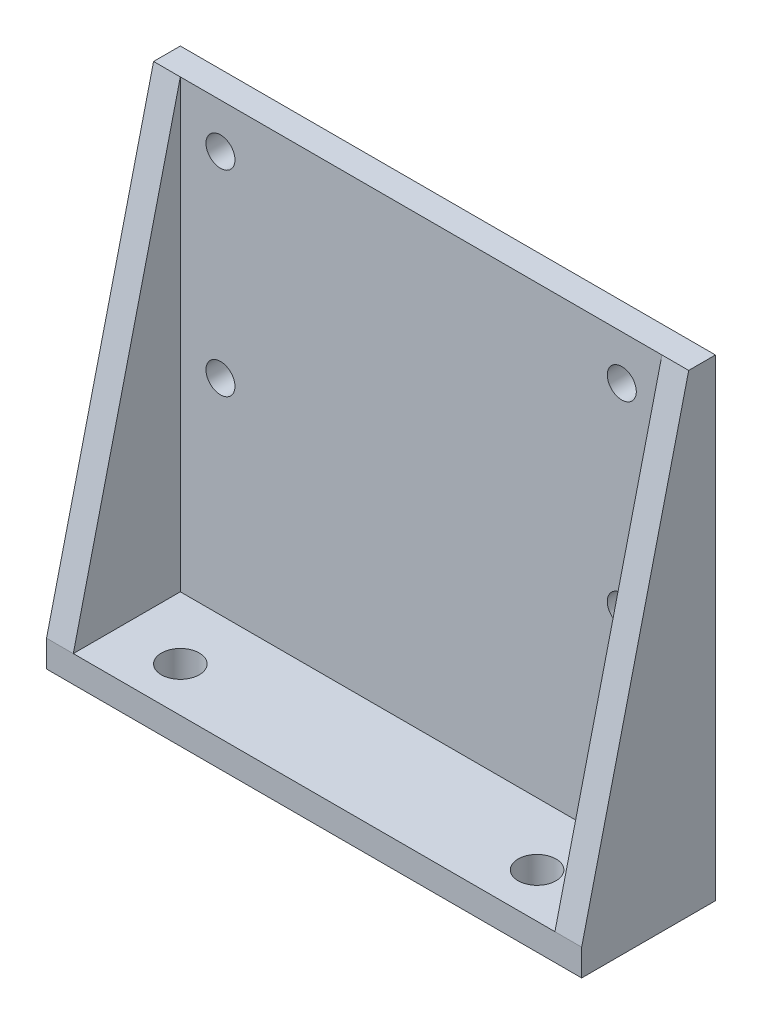
ISO-10303-21;
HEADER;
FILE_DESCRIPTION(('STEP AP214'),'2;1');
FILE_NAME('part.step','',(''),(''),'','','');
FILE_SCHEMA(('AUTOMOTIVE_DESIGN { 1 0 10303 214 1 1 1 1 }'));
ENDSEC;
DATA;
#1=APPLICATION_CONTEXT('core data for automotive mechanical design processes');
#2=APPLICATION_PROTOCOL_DEFINITION('international standard','automotive_design',2000,#1);
#3=PRODUCT_CONTEXT('',#1,'mechanical');
#4=PRODUCT('Part','Part','',(#3));
#5=PRODUCT_RELATED_PRODUCT_CATEGORY('part','',(#4));
#6=PRODUCT_DEFINITION_FORMATION('','',#4);
#7=PRODUCT_DEFINITION_CONTEXT('part definition',#1,'design');
#8=PRODUCT_DEFINITION('design','',#6,#7);
#9=PRODUCT_DEFINITION_SHAPE('','',#8);
#10=(LENGTH_UNIT() NAMED_UNIT(*) SI_UNIT(.MILLI.,.METRE.));
#11=(NAMED_UNIT(*) PLANE_ANGLE_UNIT() SI_UNIT($,.RADIAN.));
#12=(NAMED_UNIT(*) SI_UNIT($,.STERADIAN.) SOLID_ANGLE_UNIT());
#13=UNCERTAINTY_MEASURE_WITH_UNIT(LENGTH_MEASURE(1.E-05),#10,'distance_accuracy_value','');
#14=(GEOMETRIC_REPRESENTATION_CONTEXT(3) GLOBAL_UNCERTAINTY_ASSIGNED_CONTEXT((#13)) GLOBAL_UNIT_ASSIGNED_CONTEXT((#10,
#11,#12)) REPRESENTATION_CONTEXT('',''));
#15=CARTESIAN_POINT('',(0.,0.,0.));
#16=DIRECTION('',(0.,0.,1.));
#17=DIRECTION('',(1.,0.,0.));
#18=AXIS2_PLACEMENT_3D('',#15,#16,#17);
#19=CARTESIAN_POINT('',(0.,3.,0.));
#20=DIRECTION('',(0.,-1.,0.));
#21=DIRECTION('',(0.,0.,-1.));
#22=AXIS2_PLACEMENT_3D('',#19,#20,#21);
#23=PLANE('',#22);
#24=CARTESIAN_POINT('',(10.,3.,-5.));
#25=DIRECTION('',(0.,1.,0.));
#26=DIRECTION('',(0.,0.,1.));
#27=AXIS2_PLACEMENT_3D('',#24,#25,#26);
#28=CIRCLE('',#27,2.125);
#29=CARTESIAN_POINT('',(10.,3.,-2.875));
#30=VERTEX_POINT('',#29);
#31=EDGE_CURVE('E161',#30,#30,#28,.T.);
#32=ORIENTED_EDGE('',*,*,#31,.F.);
#33=EDGE_LOOP('',(#32));
#34=FACE_BOUND('',#33,.T.);
#35=CARTESIAN_POINT('',(50.,3.,-5.00000000000001));
#36=DIRECTION('',(0.,1.,0.));
#37=DIRECTION('',(0.,0.,-1.));
#38=AXIS2_PLACEMENT_3D('',#35,#36,#37);
#39=CIRCLE('',#38,2.125);
#40=CARTESIAN_POINT('',(50.,3.,-7.12500000000001));
#41=VERTEX_POINT('',#40);
#42=EDGE_CURVE('E155',#41,#41,#39,.T.);
#43=ORIENTED_EDGE('',*,*,#42,.F.);
#44=EDGE_LOOP('',(#43));
#45=FACE_BOUND('',#44,.T.);
#46=DIRECTION('',(0.,0.,1.));
#47=VECTOR('',#46,1.);
#48=CARTESIAN_POINT('',(57.,3.,0.));
#49=LINE('',#48,#47);
#50=CARTESIAN_POINT('',(57.,3.,-12.));
#51=VERTEX_POINT('',#50);
#52=CARTESIAN_POINT('',(57.,3.,0.));
#53=VERTEX_POINT('',#52);
#54=EDGE_CURVE('E112',#51,#53,#49,.T.);
#55=ORIENTED_EDGE('',*,*,#54,.F.);
#56=DIRECTION('',(-1.,0.,0.));
#57=VECTOR('',#56,1.);
#58=CARTESIAN_POINT('',(60.,3.,-12.));
#59=LINE('',#58,#57);
#60=CARTESIAN_POINT('',(3.,3.,-12.));
#61=VERTEX_POINT('',#60);
#62=EDGE_CURVE('E134',#51,#61,#59,.T.);
#63=ORIENTED_EDGE('',*,*,#62,.T.);
#64=DIRECTION('',(0.,0.,1.));
#65=VECTOR('',#64,1.);
#66=CARTESIAN_POINT('',(3.,3.,0.));
#67=LINE('',#66,#65);
#68=CARTESIAN_POINT('',(3.,3.,0.));
#69=VERTEX_POINT('',#68);
#70=EDGE_CURVE('E230',#61,#69,#67,.T.);
#71=ORIENTED_EDGE('',*,*,#70,.T.);
#72=DIRECTION('',(1.,0.,0.));
#73=VECTOR('',#72,1.);
#74=CARTESIAN_POINT('',(0.,3.,0.));
#75=LINE('',#74,#73);
#76=EDGE_CURVE('E170',#69,#53,#75,.T.);
#77=ORIENTED_EDGE('',*,*,#76,.T.);
#78=EDGE_LOOP('',(#55,#63,#71,#77));
#79=FACE_BOUND('',#78,.T.);
#80=ADVANCED_FACE('F41',(#34,#45,#79),#23,.F.);
#81=CARTESIAN_POINT('',(0.,0.,-12.));
#82=DIRECTION('',(0.,0.,1.));
#83=DIRECTION('',(1.,0.,0.));
#84=AXIS2_PLACEMENT_3D('',#81,#82,#83);
#85=PLANE('',#84);
#86=CARTESIAN_POINT('',(7.49999999999999,48.,-12.));
#87=DIRECTION('',(0.,0.,-1.));
#88=DIRECTION('',(1.,0.,0.));
#89=AXIS2_PLACEMENT_3D('',#86,#87,#88);
#90=CIRCLE('',#89,1.625);
#91=CARTESIAN_POINT('',(9.12499999999999,48.,-12.));
#92=VERTEX_POINT('',#91);
#93=EDGE_CURVE('E218',#92,#92,#90,.T.);
#94=ORIENTED_EDGE('',*,*,#93,.T.);
#95=EDGE_LOOP('',(#94));
#96=FACE_BOUND('',#95,.T.);
#97=CARTESIAN_POINT('',(7.5,26.,-12.));
#98=DIRECTION('',(0.,0.,-1.));
#99=DIRECTION('',(1.,0.,0.));
#100=AXIS2_PLACEMENT_3D('',#97,#98,#99);
#101=CIRCLE('',#100,1.625);
#102=CARTESIAN_POINT('',(9.125,26.,-12.));
#103=VERTEX_POINT('',#102);
#104=EDGE_CURVE('E215',#103,#103,#101,.T.);
#105=ORIENTED_EDGE('',*,*,#104,.T.);
#106=EDGE_LOOP('',(#105));
#107=FACE_BOUND('',#106,.T.);
#108=CARTESIAN_POINT('',(52.5,26.,-12.));
#109=DIRECTION('',(0.,0.,-1.));
#110=DIRECTION('',(-1.,0.,0.));
#111=AXIS2_PLACEMENT_3D('',#108,#109,#110);
#112=CIRCLE('',#111,1.625);
#113=CARTESIAN_POINT('',(50.875,26.,-12.));
#114=VERTEX_POINT('',#113);
#115=EDGE_CURVE('E209',#114,#114,#112,.T.);
#116=ORIENTED_EDGE('',*,*,#115,.T.);
#117=EDGE_LOOP('',(#116));
#118=FACE_BOUND('',#117,.T.);
#119=CARTESIAN_POINT('',(52.5,48.,-12.));
#120=DIRECTION('',(0.,0.,-1.));
#121=DIRECTION('',(-1.,0.,0.));
#122=AXIS2_PLACEMENT_3D('',#119,#120,#121);
#123=CIRCLE('',#122,1.625);
#124=CARTESIAN_POINT('',(50.875,48.,-12.));
#125=VERTEX_POINT('',#124);
#126=EDGE_CURVE('E149',#125,#125,#123,.T.);
#127=ORIENTED_EDGE('',*,*,#126,.T.);
#128=EDGE_LOOP('',(#127));
#129=FACE_BOUND('',#128,.T.);
#130=ORIENTED_EDGE('',*,*,#62,.F.);
#131=DIRECTION('',(0.,-1.,0.));
#132=VECTOR('',#131,1.);
#133=CARTESIAN_POINT('',(57.,3.,-12.));
#134=LINE('',#133,#132);
#135=CARTESIAN_POINT('',(57.,53.,-12.));
#136=VERTEX_POINT('',#135);
#137=EDGE_CURVE('E110',#136,#51,#134,.T.);
#138=ORIENTED_EDGE('',*,*,#137,.F.);
#139=DIRECTION('',(1.,0.,0.));
#140=VECTOR('',#139,1.);
#141=CARTESIAN_POINT('',(60.,53.,-12.));
#142=LINE('',#141,#140);
#143=CARTESIAN_POINT('',(3.,53.,-12.));
#144=VERTEX_POINT('',#143);
#145=EDGE_CURVE('E132',#144,#136,#142,.T.);
#146=ORIENTED_EDGE('',*,*,#145,.F.);
#147=DIRECTION('',(0.,-1.,0.));
#148=VECTOR('',#147,1.);
#149=CARTESIAN_POINT('',(3.,3.,-12.));
#150=LINE('',#149,#148);
#151=EDGE_CURVE('E227',#144,#61,#150,.T.);
#152=ORIENTED_EDGE('',*,*,#151,.T.);
#153=EDGE_LOOP('',(#130,#138,#146,#152));
#154=FACE_BOUND('',#153,.T.);
#155=ADVANCED_FACE('F130',(#96,#107,#118,#129,#154),#85,.T.);
#156=CARTESIAN_POINT('',(0.,0.,0.));
#157=DIRECTION('',(0.,-1.,0.));
#158=DIRECTION('',(0.,0.,-1.));
#159=AXIS2_PLACEMENT_3D('',#156,#157,#158);
#160=PLANE('',#159);
#161=CARTESIAN_POINT('',(10.,0.,-5.));
#162=DIRECTION('',(0.,1.,0.));
#163=DIRECTION('',(0.,0.,1.));
#164=AXIS2_PLACEMENT_3D('',#161,#162,#163);
#165=CIRCLE('',#164,2.125);
#166=CARTESIAN_POINT('',(10.,0.,-2.875));
#167=VERTEX_POINT('',#166);
#168=EDGE_CURVE('E158',#167,#167,#165,.T.);
#169=ORIENTED_EDGE('',*,*,#168,.T.);
#170=EDGE_LOOP('',(#169));
#171=FACE_BOUND('',#170,.T.);
#172=DIRECTION('',(0.,0.,1.));
#173=VECTOR('',#172,1.);
#174=CARTESIAN_POINT('',(0.,0.,0.));
#175=LINE('',#174,#173);
#176=CARTESIAN_POINT('',(0.,0.,-15.));
#177=VERTEX_POINT('',#176);
#178=CARTESIAN_POINT('',(0.,0.,0.));
#179=VERTEX_POINT('',#178);
#180=EDGE_CURVE('E164',#177,#179,#175,.T.);
#181=ORIENTED_EDGE('',*,*,#180,.F.);
#182=DIRECTION('',(-1.,0.,0.));
#183=VECTOR('',#182,1.);
#184=CARTESIAN_POINT('',(0.,0.,-15.));
#185=LINE('',#184,#183);
#186=CARTESIAN_POINT('',(60.,0.,-15.));
#187=VERTEX_POINT('',#186);
#188=EDGE_CURVE('E56',#187,#177,#185,.T.);
#189=ORIENTED_EDGE('',*,*,#188,.F.);
#190=DIRECTION('',(0.,0.,-1.));
#191=VECTOR('',#190,1.);
#192=CARTESIAN_POINT('',(60.,0.,0.));
#193=LINE('',#192,#191);
#194=CARTESIAN_POINT('',(60.,0.,0.));
#195=VERTEX_POINT('',#194);
#196=EDGE_CURVE('E64',#195,#187,#193,.T.);
#197=ORIENTED_EDGE('',*,*,#196,.F.);
#198=DIRECTION('',(1.,0.,0.));
#199=VECTOR('',#198,1.);
#200=CARTESIAN_POINT('',(0.,0.,0.));
#201=LINE('',#200,#199);
#202=EDGE_CURVE('E173',#179,#195,#201,.T.);
#203=ORIENTED_EDGE('',*,*,#202,.F.);
#204=EDGE_LOOP('',(#181,#189,#197,#203));
#205=FACE_BOUND('',#204,.T.);
#206=CARTESIAN_POINT('',(50.,0.,-5.00000000000001));
#207=DIRECTION('',(0.,1.,0.));
#208=DIRECTION('',(0.,0.,-1.));
#209=AXIS2_PLACEMENT_3D('',#206,#207,#208);
#210=CIRCLE('',#209,2.125);
#211=CARTESIAN_POINT('',(50.,0.,-7.12500000000001));
#212=VERTEX_POINT('',#211);
#213=EDGE_CURVE('E152',#212,#212,#210,.T.);
#214=ORIENTED_EDGE('',*,*,#213,.T.);
#215=EDGE_LOOP('',(#214));
#216=FACE_BOUND('',#215,.T.);
#217=ADVANCED_FACE('F184',(#171,#205,#216),#160,.T.);
#218=CARTESIAN_POINT('',(0.,3.,0.));
#219=DIRECTION('',(1.,0.,0.));
#220=DIRECTION('',(0.,0.,-1.));
#221=AXIS2_PLACEMENT_3D('',#218,#219,#220);
#222=PLANE('',#221);
#223=DIRECTION('',(0.,-1.,0.));
#224=VECTOR('',#223,1.);
#225=CARTESIAN_POINT('',(0.,3.,0.));
#226=LINE('',#225,#224);
#227=CARTESIAN_POINT('',(0.,3.,0.));
#228=VERTEX_POINT('',#227);
#229=EDGE_CURVE('E11',#228,#179,#226,.T.);
#230=ORIENTED_EDGE('',*,*,#229,.F.);
#231=DIRECTION('',(0.,0.972387301980517,-0.233372952475324));
#232=VECTOR('',#231,1.);
#233=CARTESIAN_POINT('',(0.,53.,-12.));
#234=LINE('',#233,#232);
#235=CARTESIAN_POINT('',(0.,53.,-12.));
#236=VERTEX_POINT('',#235);
#237=EDGE_CURVE('E225',#228,#236,#234,.T.);
#238=ORIENTED_EDGE('',*,*,#237,.T.);
#239=DIRECTION('',(0.,0.,-1.));
#240=VECTOR('',#239,1.);
#241=CARTESIAN_POINT('',(0.,53.,-12.));
#242=LINE('',#241,#240);
#243=CARTESIAN_POINT('',(0.,53.,-15.));
#244=VERTEX_POINT('',#243);
#245=EDGE_CURVE('E142',#236,#244,#242,.T.);
#246=ORIENTED_EDGE('',*,*,#245,.T.);
#247=DIRECTION('',(0.,-1.,0.));
#248=VECTOR('',#247,1.);
#249=CARTESIAN_POINT('',(0.,3.,-15.));
#250=LINE('',#249,#248);
#251=EDGE_CURVE('E169',#244,#177,#250,.T.);
#252=ORIENTED_EDGE('',*,*,#251,.T.);
#253=ORIENTED_EDGE('',*,*,#180,.T.);
#254=EDGE_LOOP('',(#230,#238,#246,#252,#253));
#255=FACE_BOUND('',#254,.T.);
#256=ADVANCED_FACE('F43',(#255),#222,.F.);
#257=CARTESIAN_POINT('',(0.,3.,0.));
#258=DIRECTION('',(0.,0.,-1.));
#259=DIRECTION('',(-1.,0.,0.));
#260=AXIS2_PLACEMENT_3D('',#257,#258,#259);
#261=PLANE('',#260);
#262=ORIENTED_EDGE('',*,*,#202,.T.);
#263=DIRECTION('',(0.,-1.,0.));
#264=VECTOR('',#263,1.);
#265=CARTESIAN_POINT('',(60.,3.,0.));
#266=LINE('',#265,#264);
#267=CARTESIAN_POINT('',(60.,3.,0.));
#268=VERTEX_POINT('',#267);
#269=EDGE_CURVE('E49',#268,#195,#266,.T.);
#270=ORIENTED_EDGE('',*,*,#269,.F.);
#271=DIRECTION('',(1.,0.,0.));
#272=VECTOR('',#271,1.);
#273=CARTESIAN_POINT('',(57.,3.,0.));
#274=LINE('',#273,#272);
#275=EDGE_CURVE('E125',#53,#268,#274,.T.);
#276=ORIENTED_EDGE('',*,*,#275,.F.);
#277=ORIENTED_EDGE('',*,*,#76,.F.);
#278=EDGE_CURVE('E167',#228,#69,#75,.T.);
#279=ORIENTED_EDGE('',*,*,#278,.F.);
#280=ORIENTED_EDGE('',*,*,#229,.T.);
#281=EDGE_LOOP('',(#262,#270,#276,#277,#279,#280));
#282=FACE_BOUND('',#281,.T.);
#283=ADVANCED_FACE('F238',(#282),#261,.F.);
#284=CARTESIAN_POINT('',(60.,3.,0.));
#285=DIRECTION('',(-1.,0.,0.));
#286=DIRECTION('',(0.,0.,1.));
#287=AXIS2_PLACEMENT_3D('',#284,#285,#286);
#288=PLANE('',#287);
#289=ORIENTED_EDGE('',*,*,#196,.T.);
#290=DIRECTION('',(0.,-1.,0.));
#291=VECTOR('',#290,1.);
#292=CARTESIAN_POINT('',(60.,3.,-15.));
#293=LINE('',#292,#291);
#294=CARTESIAN_POINT('',(60.,53.,-15.));
#295=VERTEX_POINT('',#294);
#296=EDGE_CURVE('E178',#295,#187,#293,.T.);
#297=ORIENTED_EDGE('',*,*,#296,.F.);
#298=DIRECTION('',(0.,0.,-1.));
#299=VECTOR('',#298,1.);
#300=CARTESIAN_POINT('',(60.,53.,-12.));
#301=LINE('',#300,#299);
#302=CARTESIAN_POINT('',(60.,53.,-12.));
#303=VERTEX_POINT('',#302);
#304=EDGE_CURVE('E150',#303,#295,#301,.T.);
#305=ORIENTED_EDGE('',*,*,#304,.F.);
#306=DIRECTION('',(0.,0.972387301980517,-0.233372952475324));
#307=VECTOR('',#306,1.);
#308=CARTESIAN_POINT('',(60.,53.,-12.));
#309=LINE('',#308,#307);
#310=EDGE_CURVE('E120',#268,#303,#309,.T.);
#311=ORIENTED_EDGE('',*,*,#310,.F.);
#312=ORIENTED_EDGE('',*,*,#269,.T.);
#313=EDGE_LOOP('',(#289,#297,#305,#311,#312));
#314=FACE_BOUND('',#313,.T.);
#315=ADVANCED_FACE('F180',(#314),#288,.F.);
#316=CARTESIAN_POINT('',(0.,3.,-15.));
#317=DIRECTION('',(0.,0.,1.));
#318=DIRECTION('',(1.,0.,0.));
#319=AXIS2_PLACEMENT_3D('',#316,#317,#318);
#320=PLANE('',#319);
#321=ORIENTED_EDGE('',*,*,#188,.T.);
#322=ORIENTED_EDGE('',*,*,#251,.F.);
#323=DIRECTION('',(1.,0.,0.));
#324=VECTOR('',#323,1.);
#325=CARTESIAN_POINT('',(60.,53.,-15.));
#326=LINE('',#325,#324);
#327=EDGE_CURVE('E143',#244,#295,#326,.T.);
#328=ORIENTED_EDGE('',*,*,#327,.T.);
#329=ORIENTED_EDGE('',*,*,#296,.T.);
#330=EDGE_LOOP('',(#321,#322,#328,#329));
#331=FACE_BOUND('',#330,.T.);
#332=CARTESIAN_POINT('',(7.49999999999999,48.,-15.));
#333=DIRECTION('',(0.,0.,-1.));
#334=DIRECTION('',(1.,0.,0.));
#335=AXIS2_PLACEMENT_3D('',#332,#333,#334);
#336=CIRCLE('',#335,1.625);
#337=CARTESIAN_POINT('',(9.12499999999999,48.,-15.));
#338=VERTEX_POINT('',#337);
#339=EDGE_CURVE('E196',#338,#338,#336,.T.);
#340=ORIENTED_EDGE('',*,*,#339,.F.);
#341=EDGE_LOOP('',(#340));
#342=FACE_BOUND('',#341,.T.);
#343=CARTESIAN_POINT('',(7.5,26.,-15.));
#344=DIRECTION('',(0.,0.,-1.));
#345=DIRECTION('',(1.,0.,0.));
#346=AXIS2_PLACEMENT_3D('',#343,#344,#345);
#347=CIRCLE('',#346,1.625);
#348=CARTESIAN_POINT('',(9.125,26.,-15.));
#349=VERTEX_POINT('',#348);
#350=EDGE_CURVE('E200',#349,#349,#347,.T.);
#351=ORIENTED_EDGE('',*,*,#350,.F.);
#352=EDGE_LOOP('',(#351));
#353=FACE_BOUND('',#352,.T.);
#354=CARTESIAN_POINT('',(52.5,26.,-15.));
#355=DIRECTION('',(0.,0.,-1.));
#356=DIRECTION('',(-1.,0.,0.));
#357=AXIS2_PLACEMENT_3D('',#354,#355,#356);
#358=CIRCLE('',#357,1.625);
#359=CARTESIAN_POINT('',(50.875,26.,-15.));
#360=VERTEX_POINT('',#359);
#361=EDGE_CURVE('E204',#360,#360,#358,.T.);
#362=ORIENTED_EDGE('',*,*,#361,.F.);
#363=EDGE_LOOP('',(#362));
#364=FACE_BOUND('',#363,.T.);
#365=CARTESIAN_POINT('',(52.5,48.,-15.));
#366=DIRECTION('',(0.,0.,-1.));
#367=DIRECTION('',(-1.,0.,0.));
#368=AXIS2_PLACEMENT_3D('',#365,#366,#367);
#369=CIRCLE('',#368,1.625);
#370=CARTESIAN_POINT('',(50.875,48.,-15.));
#371=VERTEX_POINT('',#370);
#372=EDGE_CURVE('E207',#371,#371,#369,.T.);
#373=ORIENTED_EDGE('',*,*,#372,.F.);
#374=EDGE_LOOP('',(#373));
#375=FACE_BOUND('',#374,.T.);
#376=ADVANCED_FACE('F188',(#331,#342,#353,#364,#375),#320,.F.);
#377=CARTESIAN_POINT('',(10.,3.,-5.));
#378=DIRECTION('',(0.,-1.,0.));
#379=DIRECTION('',(0.,0.,-1.));
#380=AXIS2_PLACEMENT_3D('',#377,#378,#379);
#381=CYLINDRICAL_SURFACE('',#380,2.125);
#382=ORIENTED_EDGE('',*,*,#31,.T.);
#383=EDGE_LOOP('',(#382));
#384=FACE_BOUND('',#383,.T.);
#385=ORIENTED_EDGE('',*,*,#168,.F.);
#386=EDGE_LOOP('',(#385));
#387=FACE_BOUND('',#386,.T.);
#388=ADVANCED_FACE('F191',(#384,#387),#381,.F.);
#389=CARTESIAN_POINT('',(50.,3.,-5.00000000000001));
#390=DIRECTION('',(0.,-1.,0.));
#391=DIRECTION('',(0.,0.,-1.));
#392=AXIS2_PLACEMENT_3D('',#389,#390,#391);
#393=CYLINDRICAL_SURFACE('',#392,2.125);
#394=ORIENTED_EDGE('',*,*,#42,.T.);
#395=EDGE_LOOP('',(#394));
#396=FACE_BOUND('',#395,.T.);
#397=ORIENTED_EDGE('',*,*,#213,.F.);
#398=EDGE_LOOP('',(#397));
#399=FACE_BOUND('',#398,.T.);
#400=ADVANCED_FACE('F323',(#396,#399),#393,.F.);
#401=CARTESIAN_POINT('',(60.,53.,-12.));
#402=DIRECTION('',(0.,1.,0.));
#403=DIRECTION('',(0.,0.,1.));
#404=AXIS2_PLACEMENT_3D('',#401,#402,#403);
#405=PLANE('',#404);
#406=ORIENTED_EDGE('',*,*,#327,.F.);
#407=ORIENTED_EDGE('',*,*,#245,.F.);
#408=EDGE_CURVE('E140',#236,#144,#142,.T.);
#409=ORIENTED_EDGE('',*,*,#408,.T.);
#410=ORIENTED_EDGE('',*,*,#145,.T.);
#411=DIRECTION('',(1.,0.,0.));
#412=VECTOR('',#411,1.);
#413=CARTESIAN_POINT('',(57.,53.,-12.));
#414=LINE('',#413,#412);
#415=EDGE_CURVE('E117',#136,#303,#414,.T.);
#416=ORIENTED_EDGE('',*,*,#415,.T.);
#417=ORIENTED_EDGE('',*,*,#304,.T.);
#418=EDGE_LOOP('',(#406,#407,#409,#410,#416,#417));
#419=FACE_BOUND('',#418,.T.);
#420=ADVANCED_FACE('F137',(#419),#405,.T.);
#421=CARTESIAN_POINT('',(52.5,48.,-12.));
#422=DIRECTION('',(0.,0.,-1.));
#423=DIRECTION('',(-1.,0.,0.));
#424=AXIS2_PLACEMENT_3D('',#421,#422,#423);
#425=CYLINDRICAL_SURFACE('',#424,1.625);
#426=ORIENTED_EDGE('',*,*,#126,.F.);
#427=EDGE_LOOP('',(#426));
#428=FACE_BOUND('',#427,.T.);
#429=ORIENTED_EDGE('',*,*,#372,.T.);
#430=EDGE_LOOP('',(#429));
#431=FACE_BOUND('',#430,.T.);
#432=ADVANCED_FACE('F302',(#428,#431),#425,.F.);
#433=CARTESIAN_POINT('',(52.5,26.,-12.));
#434=DIRECTION('',(0.,0.,-1.));
#435=DIRECTION('',(-1.,0.,0.));
#436=AXIS2_PLACEMENT_3D('',#433,#434,#435);
#437=CYLINDRICAL_SURFACE('',#436,1.625);
#438=ORIENTED_EDGE('',*,*,#115,.F.);
#439=EDGE_LOOP('',(#438));
#440=FACE_BOUND('',#439,.T.);
#441=ORIENTED_EDGE('',*,*,#361,.T.);
#442=EDGE_LOOP('',(#441));
#443=FACE_BOUND('',#442,.T.);
#444=ADVANCED_FACE('F293',(#440,#443),#437,.F.);
#445=CARTESIAN_POINT('',(7.5,26.,-12.));
#446=DIRECTION('',(0.,0.,-1.));
#447=DIRECTION('',(-1.,0.,0.));
#448=AXIS2_PLACEMENT_3D('',#445,#446,#447);
#449=CYLINDRICAL_SURFACE('',#448,1.625);
#450=ORIENTED_EDGE('',*,*,#104,.F.);
#451=EDGE_LOOP('',(#450));
#452=FACE_BOUND('',#451,.T.);
#453=ORIENTED_EDGE('',*,*,#350,.T.);
#454=EDGE_LOOP('',(#453));
#455=FACE_BOUND('',#454,.T.);
#456=ADVANCED_FACE('F256',(#452,#455),#449,.F.);
#457=CARTESIAN_POINT('',(7.49999999999999,48.,-12.));
#458=DIRECTION('',(0.,0.,-1.));
#459=DIRECTION('',(-1.,0.,0.));
#460=AXIS2_PLACEMENT_3D('',#457,#458,#459);
#461=CYLINDRICAL_SURFACE('',#460,1.625);
#462=ORIENTED_EDGE('',*,*,#93,.F.);
#463=EDGE_LOOP('',(#462));
#464=FACE_BOUND('',#463,.T.);
#465=ORIENTED_EDGE('',*,*,#339,.T.);
#466=EDGE_LOOP('',(#465));
#467=FACE_BOUND('',#466,.T.);
#468=ADVANCED_FACE('F248',(#464,#467),#461,.F.);
#469=CARTESIAN_POINT('',(3.,53.,-12.));
#470=DIRECTION('',(0.,0.233372952475324,0.972387301980517));
#471=DIRECTION('',(0.,-0.972387301980518,0.233372952475324));
#472=AXIS2_PLACEMENT_3D('',#469,#470,#471);
#473=PLANE('',#472);
#474=ORIENTED_EDGE('',*,*,#237,.F.);
#475=ORIENTED_EDGE('',*,*,#278,.T.);
#476=DIRECTION('',(0.,0.972387301980517,-0.233372952475324));
#477=VECTOR('',#476,1.);
#478=CARTESIAN_POINT('',(3.,53.,-12.));
#479=LINE('',#478,#477);
#480=EDGE_CURVE('E222',#69,#144,#479,.T.);
#481=ORIENTED_EDGE('',*,*,#480,.T.);
#482=ORIENTED_EDGE('',*,*,#408,.F.);
#483=EDGE_LOOP('',(#474,#475,#481,#482));
#484=FACE_BOUND('',#483,.T.);
#485=ADVANCED_FACE('F246',(#484),#473,.T.);
#486=CARTESIAN_POINT('',(3.,0.,0.));
#487=DIRECTION('',(-1.,0.,0.));
#488=DIRECTION('',(0.,0.,1.));
#489=AXIS2_PLACEMENT_3D('',#486,#487,#488);
#490=PLANE('',#489);
#491=ORIENTED_EDGE('',*,*,#151,.F.);
#492=ORIENTED_EDGE('',*,*,#480,.F.);
#493=ORIENTED_EDGE('',*,*,#70,.F.);
#494=EDGE_LOOP('',(#491,#492,#493));
#495=FACE_BOUND('',#494,.T.);
#496=ADVANCED_FACE('F244',(#495),#490,.F.);
#497=CARTESIAN_POINT('',(57.,53.,-12.));
#498=DIRECTION('',(0.,-0.233372952475324,-0.972387301980517));
#499=DIRECTION('',(0.,0.972387301980518,-0.233372952475324));
#500=AXIS2_PLACEMENT_3D('',#497,#498,#499);
#501=PLANE('',#500);
#502=ORIENTED_EDGE('',*,*,#310,.T.);
#503=ORIENTED_EDGE('',*,*,#415,.F.);
#504=DIRECTION('',(0.,0.972387301980517,-0.233372952475324));
#505=VECTOR('',#504,1.);
#506=CARTESIAN_POINT('',(57.,53.,-12.));
#507=LINE('',#506,#505);
#508=EDGE_CURVE('E106',#53,#136,#507,.T.);
#509=ORIENTED_EDGE('',*,*,#508,.F.);
#510=ORIENTED_EDGE('',*,*,#275,.T.);
#511=EDGE_LOOP('',(#502,#503,#509,#510));
#512=FACE_BOUND('',#511,.T.);
#513=ADVANCED_FACE('F118',(#512),#501,.F.);
#514=CARTESIAN_POINT('',(57.,0.,0.));
#515=DIRECTION('',(1.,0.,0.));
#516=DIRECTION('',(0.,0.,1.));
#517=AXIS2_PLACEMENT_3D('',#514,#515,#516);
#518=PLANE('',#517);
#519=ORIENTED_EDGE('',*,*,#137,.T.);
#520=ORIENTED_EDGE('',*,*,#54,.T.);
#521=ORIENTED_EDGE('',*,*,#508,.T.);
#522=EDGE_LOOP('',(#519,#520,#521));
#523=FACE_BOUND('',#522,.T.);
#524=ADVANCED_FACE('F108',(#523),#518,.F.);
#525=CLOSED_SHELL('',(#80,#155,#217,#256,#283,#315,#376,#388,#400,#420,#432,#444,#456,#468,#485,
#496,#513,#524));
#526=MANIFOLD_SOLID_BREP('B2',#525);
#527=ADVANCED_BREP_SHAPE_REPRESENTATION('',(#18,#526),#14);
#528=SHAPE_DEFINITION_REPRESENTATION(#9,#527);
ENDSEC;
END-ISO-10303-21;
